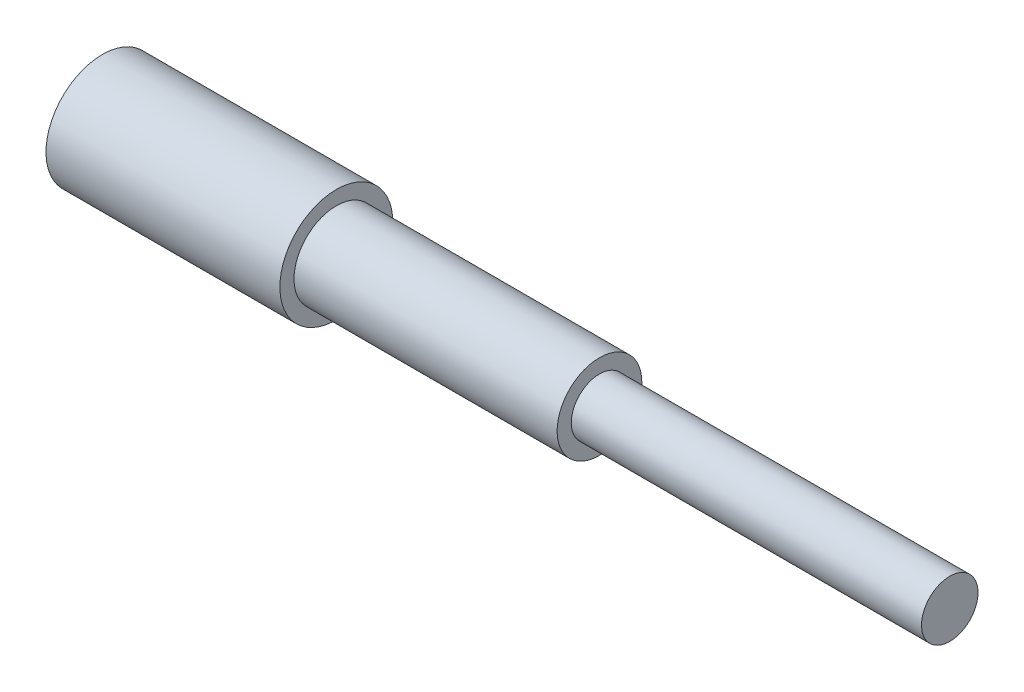
ISO-10303-21;
HEADER;
FILE_DESCRIPTION(('STEP AP214'),'2;1');
FILE_NAME('part.step','',(''),(''),'','','');
FILE_SCHEMA(('AUTOMOTIVE_DESIGN { 1 0 10303 214 1 1 1 1 }'));
ENDSEC;
DATA;
#1=APPLICATION_CONTEXT('core data for automotive mechanical design processes');
#2=APPLICATION_PROTOCOL_DEFINITION('international standard','automotive_design',2000,#1);
#3=PRODUCT_CONTEXT('',#1,'mechanical');
#4=PRODUCT('Part','Part','',(#3));
#5=PRODUCT_RELATED_PRODUCT_CATEGORY('part','',(#4));
#6=PRODUCT_DEFINITION_FORMATION('','',#4);
#7=PRODUCT_DEFINITION_CONTEXT('part definition',#1,'design');
#8=PRODUCT_DEFINITION('design','',#6,#7);
#9=PRODUCT_DEFINITION_SHAPE('','',#8);
#10=(LENGTH_UNIT() NAMED_UNIT(*) SI_UNIT(.MILLI.,.METRE.));
#11=(NAMED_UNIT(*) PLANE_ANGLE_UNIT() SI_UNIT($,.RADIAN.));
#12=(NAMED_UNIT(*) SI_UNIT($,.STERADIAN.) SOLID_ANGLE_UNIT());
#13=UNCERTAINTY_MEASURE_WITH_UNIT(LENGTH_MEASURE(1.E-05),#10,'distance_accuracy_value','');
#14=(GEOMETRIC_REPRESENTATION_CONTEXT(3) GLOBAL_UNCERTAINTY_ASSIGNED_CONTEXT((#13)) GLOBAL_UNIT_ASSIGNED_CONTEXT((#10,
#11,#12)) REPRESENTATION_CONTEXT('',''));
#15=CARTESIAN_POINT('',(0.,0.,0.));
#16=DIRECTION('',(0.,0.,1.));
#17=DIRECTION('',(1.,0.,0.));
#18=AXIS2_PLACEMENT_3D('',#15,#16,#17);
#19=CARTESIAN_POINT('',(-124.699839545964,0.,0.));
#20=DIRECTION('',(-1.,0.,0.));
#21=DIRECTION('',(0.,-1.,0.));
#22=AXIS2_PLACEMENT_3D('',#19,#20,#21);
#23=PLANE('',#22);
#24=CARTESIAN_POINT('',(-124.699839545964,0.,0.));
#25=DIRECTION('',(1.,0.,0.));
#26=DIRECTION('',(0.,1.,0.));
#27=AXIS2_PLACEMENT_3D('',#24,#25,#26);
#28=CIRCLE('',#27,20.);
#29=CARTESIAN_POINT('',(-124.699839545964,20.,0.));
#30=VERTEX_POINT('',#29);
#31=EDGE_CURVE('E12',#30,#30,#28,.T.);
#32=ORIENTED_EDGE('',*,*,#31,.F.);
#33=EDGE_LOOP('',(#32));
#34=FACE_BOUND('',#33,.T.);
#35=ADVANCED_FACE('F49',(#34),#23,.T.);
#36=CARTESIAN_POINT('',(175.300160454036,0.,0.));
#37=DIRECTION('',(1.,0.,0.));
#38=DIRECTION('',(0.,1.,0.));
#39=AXIS2_PLACEMENT_3D('',#36,#37,#38);
#40=CYLINDRICAL_SURFACE('',#39,20.);
#41=ORIENTED_EDGE('',*,*,#31,.T.);
#42=EDGE_LOOP('',(#41));
#43=FACE_BOUND('',#42,.T.);
#44=CARTESIAN_POINT('',(-41.888287939421,0.,0.));
#45=DIRECTION('',(1.,0.,0.));
#46=DIRECTION('',(0.,1.,0.));
#47=AXIS2_PLACEMENT_3D('',#44,#45,#46);
#48=CIRCLE('',#47,20.);
#49=CARTESIAN_POINT('',(-41.888287939421,20.,0.));
#50=VERTEX_POINT('',#49);
#51=EDGE_CURVE('E55',#50,#50,#48,.T.);
#52=ORIENTED_EDGE('',*,*,#51,.F.);
#53=EDGE_LOOP('',(#52));
#54=FACE_BOUND('',#53,.T.);
#55=ADVANCED_FACE('F91',(#43,#54),#40,.T.);
#56=CARTESIAN_POINT('',(-41.8882879394209,20.,0.));
#57=DIRECTION('',(1.,0.,0.));
#58=DIRECTION('',(0.,1.,0.));
#59=AXIS2_PLACEMENT_3D('',#56,#57,#58);
#60=PLANE('',#59);
#61=ORIENTED_EDGE('',*,*,#51,.T.);
#62=EDGE_LOOP('',(#61));
#63=FACE_BOUND('',#62,.T.);
#64=CARTESIAN_POINT('',(-41.888287939421,0.,0.));
#65=DIRECTION('',(1.,0.,0.));
#66=DIRECTION('',(0.,1.,0.));
#67=AXIS2_PLACEMENT_3D('',#64,#65,#66);
#68=CIRCLE('',#67,15.);
#69=CARTESIAN_POINT('',(-41.888287939421,15.,0.));
#70=VERTEX_POINT('',#69);
#71=EDGE_CURVE('E59',#70,#70,#68,.T.);
#72=ORIENTED_EDGE('',*,*,#71,.F.);
#73=EDGE_LOOP('',(#72));
#74=FACE_BOUND('',#73,.T.);
#75=ADVANCED_FACE('F96',(#63,#74),#60,.T.);
#76=CARTESIAN_POINT('',(175.300160454036,0.,0.));
#77=DIRECTION('',(1.,0.,0.));
#78=DIRECTION('',(0.,1.,0.));
#79=AXIS2_PLACEMENT_3D('',#76,#77,#78);
#80=CYLINDRICAL_SURFACE('',#79,15.);
#81=ORIENTED_EDGE('',*,*,#71,.T.);
#82=EDGE_LOOP('',(#81));
#83=FACE_BOUND('',#82,.T.);
#84=CARTESIAN_POINT('',(51.2747076179403,0.,0.));
#85=DIRECTION('',(1.,0.,0.));
#86=DIRECTION('',(0.,1.,0.));
#87=AXIS2_PLACEMENT_3D('',#84,#85,#86);
#88=CIRCLE('',#87,15.);
#89=CARTESIAN_POINT('',(51.2747076179403,15.,0.));
#90=VERTEX_POINT('',#89);
#91=EDGE_CURVE('E63',#90,#90,#88,.T.);
#92=ORIENTED_EDGE('',*,*,#91,.F.);
#93=EDGE_LOOP('',(#92));
#94=FACE_BOUND('',#93,.T.);
#95=ADVANCED_FACE('F87',(#83,#94),#80,.T.);
#96=CARTESIAN_POINT('',(51.2747076179403,15.,0.));
#97=DIRECTION('',(1.,0.,0.));
#98=DIRECTION('',(0.,1.,0.));
#99=AXIS2_PLACEMENT_3D('',#96,#97,#98);
#100=PLANE('',#99);
#101=ORIENTED_EDGE('',*,*,#91,.T.);
#102=EDGE_LOOP('',(#101));
#103=FACE_BOUND('',#102,.T.);
#104=CARTESIAN_POINT('',(51.2747076179403,0.,0.));
#105=DIRECTION('',(1.,0.,0.));
#106=DIRECTION('',(0.,1.,0.));
#107=AXIS2_PLACEMENT_3D('',#104,#105,#106);
#108=CIRCLE('',#107,10.);
#109=CARTESIAN_POINT('',(51.2747076179403,10.,0.));
#110=VERTEX_POINT('',#109);
#111=EDGE_CURVE('E68',#110,#110,#108,.T.);
#112=ORIENTED_EDGE('',*,*,#111,.F.);
#113=EDGE_LOOP('',(#112));
#114=FACE_BOUND('',#113,.T.);
#115=ADVANCED_FACE('F79',(#103,#114),#100,.T.);
#116=CARTESIAN_POINT('',(175.300160454036,0.,0.));
#117=DIRECTION('',(1.,0.,0.));
#118=DIRECTION('',(0.,1.,0.));
#119=AXIS2_PLACEMENT_3D('',#116,#117,#118);
#120=CYLINDRICAL_SURFACE('',#119,9.99999999999999);
#121=ORIENTED_EDGE('',*,*,#111,.T.);
#122=EDGE_LOOP('',(#121));
#123=FACE_BOUND('',#122,.T.);
#124=CARTESIAN_POINT('',(175.300160454036,0.,0.));
#125=DIRECTION('',(1.,0.,0.));
#126=DIRECTION('',(0.,1.,0.));
#127=AXIS2_PLACEMENT_3D('',#124,#125,#126);
#128=CIRCLE('',#127,9.99999999999998);
#129=CARTESIAN_POINT('',(175.300160454036,10.,0.));
#130=VERTEX_POINT('',#129);
#131=EDGE_CURVE('E71',#130,#130,#128,.T.);
#132=ORIENTED_EDGE('',*,*,#131,.F.);
#133=EDGE_LOOP('',(#132));
#134=FACE_BOUND('',#133,.T.);
#135=ADVANCED_FACE('F77',(#123,#134),#120,.T.);
#136=CARTESIAN_POINT('',(175.300160454036,10.,0.));
#137=DIRECTION('',(1.,0.,0.));
#138=DIRECTION('',(0.,1.,0.));
#139=AXIS2_PLACEMENT_3D('',#136,#137,#138);
#140=PLANE('',#139);
#141=ORIENTED_EDGE('',*,*,#131,.T.);
#142=EDGE_LOOP('',(#141));
#143=FACE_BOUND('',#142,.T.);
#144=ADVANCED_FACE('F75',(#143),#140,.T.);
#145=CLOSED_SHELL('',(#35,#55,#75,#95,#115,#135,#144));
#146=MANIFOLD_SOLID_BREP('B2',#145);
#147=ADVANCED_BREP_SHAPE_REPRESENTATION('',(#18,#146),#14);
#148=SHAPE_DEFINITION_REPRESENTATION(#9,#147);
ENDSEC;
END-ISO-10303-21;
